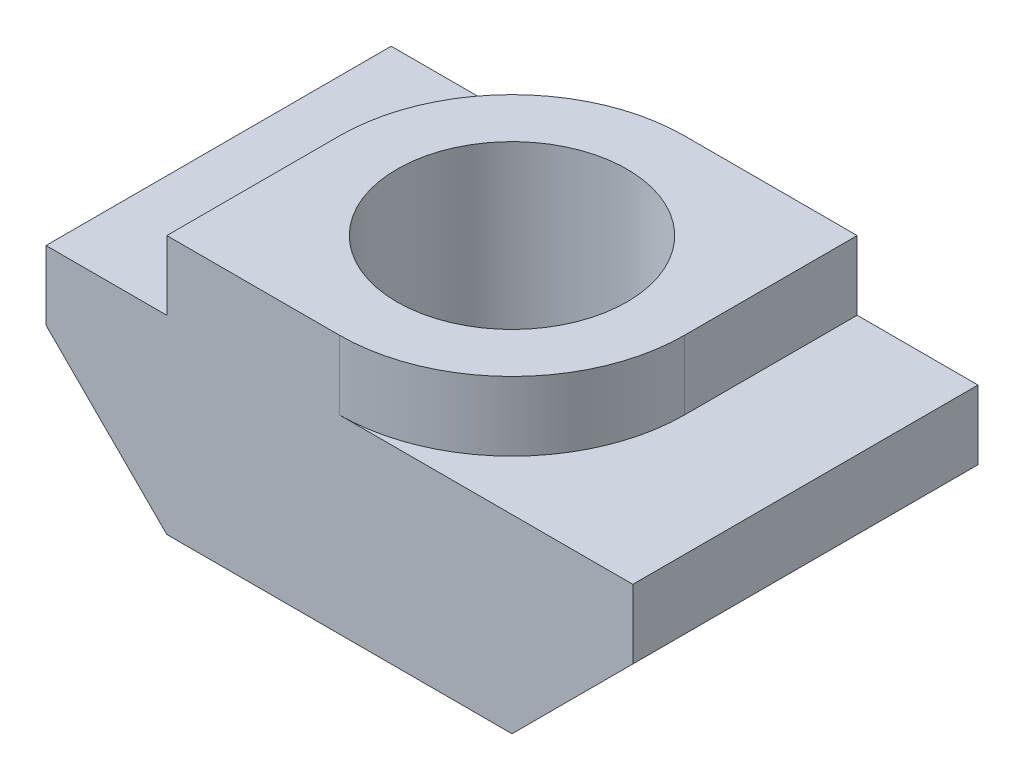
ISO-10303-21;
HEADER;
FILE_DESCRIPTION(('STEP AP214'),'2;1');
FILE_NAME('part.step','',(''),(''),'','','');
FILE_SCHEMA(('AUTOMOTIVE_DESIGN { 1 0 10303 214 1 1 1 1 }'));
ENDSEC;
DATA;
#1=APPLICATION_CONTEXT('core data for automotive mechanical design processes');
#2=APPLICATION_PROTOCOL_DEFINITION('international standard','automotive_design',2000,#1);
#3=PRODUCT_CONTEXT('',#1,'mechanical');
#4=PRODUCT('Part','Part','',(#3));
#5=PRODUCT_RELATED_PRODUCT_CATEGORY('part','',(#4));
#6=PRODUCT_DEFINITION_FORMATION('','',#4);
#7=PRODUCT_DEFINITION_CONTEXT('part definition',#1,'design');
#8=PRODUCT_DEFINITION('design','',#6,#7);
#9=PRODUCT_DEFINITION_SHAPE('','',#8);
#10=(LENGTH_UNIT() NAMED_UNIT(*) SI_UNIT(.MILLI.,.METRE.));
#11=(NAMED_UNIT(*) PLANE_ANGLE_UNIT() SI_UNIT($,.RADIAN.));
#12=(NAMED_UNIT(*) SI_UNIT($,.STERADIAN.) SOLID_ANGLE_UNIT());
#13=UNCERTAINTY_MEASURE_WITH_UNIT(LENGTH_MEASURE(1.E-05),#10,'distance_accuracy_value','');
#14=(GEOMETRIC_REPRESENTATION_CONTEXT(3) GLOBAL_UNCERTAINTY_ASSIGNED_CONTEXT((#13)) GLOBAL_UNIT_ASSIGNED_CONTEXT((#10,
#11,#12)) REPRESENTATION_CONTEXT('',''));
#15=CARTESIAN_POINT('',(0.,0.,0.));
#16=DIRECTION('',(0.,0.,1.));
#17=DIRECTION('',(1.,0.,0.));
#18=AXIS2_PLACEMENT_3D('',#15,#16,#17);
#19=CARTESIAN_POINT('',(0.,3.3,0.));
#20=DIRECTION('',(0.,-1.,0.));
#21=DIRECTION('',(0.,0.,-1.));
#22=AXIS2_PLACEMENT_3D('',#19,#20,#21);
#23=PLANE('',#22);
#24=DIRECTION('',(0.,0.,1.));
#25=VECTOR('',#24,1.);
#26=CARTESIAN_POINT('',(2.1,3.3,0.));
#27=LINE('',#26,#25);
#28=CARTESIAN_POINT('',(2.1,3.3,-3.));
#29=VERTEX_POINT('',#28);
#30=CARTESIAN_POINT('',(2.1,3.3,0.));
#31=VERTEX_POINT('',#30);
#32=EDGE_CURVE('E127',#29,#31,#27,.T.);
#33=ORIENTED_EDGE('',*,*,#32,.F.);
#34=CARTESIAN_POINT('',(5.1,3.3,-3.));
#35=DIRECTION('',(0.,-1.,0.));
#36=DIRECTION('',(0.,0.,-1.));
#37=AXIS2_PLACEMENT_3D('',#34,#35,#36);
#38=CIRCLE('',#37,3.);
#39=CARTESIAN_POINT('',(5.1,3.3,-6.));
#40=VERTEX_POINT('',#39);
#41=EDGE_CURVE('E186',#29,#40,#38,.T.);
#42=ORIENTED_EDGE('',*,*,#41,.T.);
#43=DIRECTION('',(-1.,0.,0.));
#44=VECTOR('',#43,1.);
#45=CARTESIAN_POINT('',(0.,3.3,-6.));
#46=LINE('',#45,#44);
#47=CARTESIAN_POINT('',(0.,3.3,-6.));
#48=VERTEX_POINT('',#47);
#49=EDGE_CURVE('E149',#40,#48,#46,.T.);
#50=ORIENTED_EDGE('',*,*,#49,.T.);
#51=DIRECTION('',(0.,0.,1.));
#52=VECTOR('',#51,1.);
#53=CARTESIAN_POINT('',(0.,3.3,0.));
#54=LINE('',#53,#52);
#55=CARTESIAN_POINT('',(0.,3.3,0.));
#56=VERTEX_POINT('',#55);
#57=EDGE_CURVE('E142',#48,#56,#54,.T.);
#58=ORIENTED_EDGE('',*,*,#57,.T.);
#59=DIRECTION('',(1.,0.,0.));
#60=VECTOR('',#59,1.);
#61=CARTESIAN_POINT('',(0.,3.3,0.));
#62=LINE('',#61,#60);
#63=EDGE_CURVE('E223',#56,#31,#62,.T.);
#64=ORIENTED_EDGE('',*,*,#63,.T.);
#65=EDGE_LOOP('',(#33,#42,#50,#58,#64));
#66=FACE_BOUND('',#65,.T.);
#67=ADVANCED_FACE('F33',(#66),#23,.F.);
#68=CARTESIAN_POINT('',(0.,3.3,0.));
#69=DIRECTION('',(1.,0.,0.));
#70=DIRECTION('',(0.,0.,-1.));
#71=AXIS2_PLACEMENT_3D('',#68,#69,#70);
#72=PLANE('',#71);
#73=DIRECTION('',(0.,-1.,0.));
#74=VECTOR('',#73,1.);
#75=CARTESIAN_POINT('',(0.,3.3,-6.));
#76=LINE('',#75,#74);
#77=CARTESIAN_POINT('',(0.,2.1,-6.));
#78=VERTEX_POINT('',#77);
#79=EDGE_CURVE('E135',#48,#78,#76,.T.);
#80=ORIENTED_EDGE('',*,*,#79,.T.);
#81=DIRECTION('',(0.,0.,1.));
#82=VECTOR('',#81,1.);
#83=CARTESIAN_POINT('',(0.,2.1,-6.));
#84=LINE('',#83,#82);
#85=CARTESIAN_POINT('',(0.,2.1,0.));
#86=VERTEX_POINT('',#85);
#87=EDGE_CURVE('E120',#78,#86,#84,.T.);
#88=ORIENTED_EDGE('',*,*,#87,.T.);
#89=DIRECTION('',(0.,-1.,0.));
#90=VECTOR('',#89,1.);
#91=CARTESIAN_POINT('',(0.,3.3,0.));
#92=LINE('',#91,#90);
#93=EDGE_CURVE('E11',#56,#86,#92,.T.);
#94=ORIENTED_EDGE('',*,*,#93,.F.);
#95=ORIENTED_EDGE('',*,*,#57,.F.);
#96=EDGE_LOOP('',(#80,#88,#94,#95));
#97=FACE_BOUND('',#96,.T.);
#98=ADVANCED_FACE('F35',(#97),#72,.F.);
#99=CARTESIAN_POINT('',(0.,3.3,0.));
#100=DIRECTION('',(0.,0.,-1.));
#101=DIRECTION('',(-1.,0.,0.));
#102=AXIS2_PLACEMENT_3D('',#99,#100,#101);
#103=PLANE('',#102);
#104=ORIENTED_EDGE('',*,*,#93,.T.);
#105=DIRECTION('',(-0.707106781186546,0.707106781186549,0.));
#106=VECTOR('',#105,1.);
#107=CARTESIAN_POINT('',(0.,2.1,0.));
#108=LINE('',#107,#106);
#109=CARTESIAN_POINT('',(2.09999999999999,0.,0.));
#110=VERTEX_POINT('',#109);
#111=EDGE_CURVE('E123',#110,#86,#108,.T.);
#112=ORIENTED_EDGE('',*,*,#111,.F.);
#113=DIRECTION('',(1.,0.,0.));
#114=VECTOR('',#113,1.);
#115=CARTESIAN_POINT('',(0.,0.,0.));
#116=LINE('',#115,#114);
#117=CARTESIAN_POINT('',(8.10000000000001,0.,0.));
#118=VERTEX_POINT('',#117);
#119=EDGE_CURVE('E169',#110,#118,#116,.T.);
#120=ORIENTED_EDGE('',*,*,#119,.T.);
#121=DIRECTION('',(-0.707106781186546,-0.707106781186549,0.));
#122=VECTOR('',#121,1.);
#123=CARTESIAN_POINT('',(8.10000000000001,0.,0.));
#124=LINE('',#123,#122);
#125=CARTESIAN_POINT('',(10.2,2.1,0.));
#126=VERTEX_POINT('',#125);
#127=EDGE_CURVE('E48',#126,#118,#124,.T.);
#128=ORIENTED_EDGE('',*,*,#127,.F.);
#129=DIRECTION('',(0.,-1.,0.));
#130=VECTOR('',#129,1.);
#131=CARTESIAN_POINT('',(10.2,3.3,0.));
#132=LINE('',#131,#130);
#133=CARTESIAN_POINT('',(10.2,3.3,0.));
#134=VERTEX_POINT('',#133);
#135=EDGE_CURVE('E41',#134,#126,#132,.T.);
#136=ORIENTED_EDGE('',*,*,#135,.F.);
#137=CARTESIAN_POINT('',(5.1,3.3,0.));
#138=VERTEX_POINT('',#137);
#139=EDGE_CURVE('E166',#138,#134,#62,.T.);
#140=ORIENTED_EDGE('',*,*,#139,.F.);
#141=DIRECTION('',(0.,-1.,0.));
#142=VECTOR('',#141,1.);
#143=CARTESIAN_POINT('',(5.1,4.5,0.));
#144=LINE('',#143,#142);
#145=CARTESIAN_POINT('',(5.1,4.5,0.));
#146=VERTEX_POINT('',#145);
#147=EDGE_CURVE('E218',#146,#138,#144,.T.);
#148=ORIENTED_EDGE('',*,*,#147,.F.);
#149=DIRECTION('',(1.,0.,0.));
#150=VECTOR('',#149,1.);
#151=CARTESIAN_POINT('',(0.,4.5,0.));
#152=LINE('',#151,#150);
#153=CARTESIAN_POINT('',(2.1,4.5,0.));
#154=VERTEX_POINT('',#153);
#155=EDGE_CURVE('E185',#154,#146,#152,.T.);
#156=ORIENTED_EDGE('',*,*,#155,.F.);
#157=DIRECTION('',(0.,-1.,0.));
#158=VECTOR('',#157,1.);
#159=CARTESIAN_POINT('',(2.1,4.5,0.));
#160=LINE('',#159,#158);
#161=EDGE_CURVE('E220',#154,#31,#160,.T.);
#162=ORIENTED_EDGE('',*,*,#161,.T.);
#163=ORIENTED_EDGE('',*,*,#63,.F.);
#164=EDGE_LOOP('',(#104,#112,#120,#128,#136,#140,#148,#156,#162,#163));
#165=FACE_BOUND('',#164,.T.);
#166=ADVANCED_FACE('F164',(#165),#103,.F.);
#167=CARTESIAN_POINT('',(10.2,3.3,0.));
#168=DIRECTION('',(-1.,0.,0.));
#169=DIRECTION('',(0.,0.,1.));
#170=AXIS2_PLACEMENT_3D('',#167,#168,#169);
#171=PLANE('',#170);
#172=ORIENTED_EDGE('',*,*,#135,.T.);
#173=DIRECTION('',(0.,0.,1.));
#174=VECTOR('',#173,1.);
#175=CARTESIAN_POINT('',(10.2,2.1,-6.));
#176=LINE('',#175,#174);
#177=CARTESIAN_POINT('',(10.2,2.1,-6.));
#178=VERTEX_POINT('',#177);
#179=EDGE_CURVE('E160',#178,#126,#176,.T.);
#180=ORIENTED_EDGE('',*,*,#179,.F.);
#181=DIRECTION('',(0.,-1.,0.));
#182=VECTOR('',#181,1.);
#183=CARTESIAN_POINT('',(10.2,3.3,-6.));
#184=LINE('',#183,#182);
#185=CARTESIAN_POINT('',(10.2,3.3,-6.));
#186=VERTEX_POINT('',#185);
#187=EDGE_CURVE('E143',#186,#178,#184,.T.);
#188=ORIENTED_EDGE('',*,*,#187,.F.);
#189=DIRECTION('',(0.,0.,-1.));
#190=VECTOR('',#189,1.);
#191=CARTESIAN_POINT('',(10.2,3.3,0.));
#192=LINE('',#191,#190);
#193=EDGE_CURVE('E161',#134,#186,#192,.T.);
#194=ORIENTED_EDGE('',*,*,#193,.F.);
#195=EDGE_LOOP('',(#172,#180,#188,#194));
#196=FACE_BOUND('',#195,.T.);
#197=ADVANCED_FACE('F158',(#196),#171,.F.);
#198=CARTESIAN_POINT('',(0.,3.3,-6.));
#199=DIRECTION('',(0.,0.,1.));
#200=DIRECTION('',(1.,0.,0.));
#201=AXIS2_PLACEMENT_3D('',#198,#199,#200);
#202=PLANE('',#201);
#203=DIRECTION('',(-1.,0.,0.));
#204=VECTOR('',#203,1.);
#205=CARTESIAN_POINT('',(0.,0.,-6.));
#206=LINE('',#205,#204);
#207=CARTESIAN_POINT('',(8.10000000000001,0.,-6.));
#208=VERTEX_POINT('',#207);
#209=CARTESIAN_POINT('',(2.09999999999999,0.,-6.));
#210=VERTEX_POINT('',#209);
#211=EDGE_CURVE('E139',#208,#210,#206,.T.);
#212=ORIENTED_EDGE('',*,*,#211,.T.);
#213=DIRECTION('',(-0.707106781186546,0.707106781186549,0.));
#214=VECTOR('',#213,1.);
#215=CARTESIAN_POINT('',(0.,2.1,-6.));
#216=LINE('',#215,#214);
#217=EDGE_CURVE('E56',#210,#78,#216,.T.);
#218=ORIENTED_EDGE('',*,*,#217,.T.);
#219=ORIENTED_EDGE('',*,*,#79,.F.);
#220=ORIENTED_EDGE('',*,*,#49,.F.);
#221=DIRECTION('',(0.,-1.,0.));
#222=VECTOR('',#221,1.);
#223=CARTESIAN_POINT('',(5.1,4.5,-6.));
#224=LINE('',#223,#222);
#225=CARTESIAN_POINT('',(5.1,4.5,-6.));
#226=VERTEX_POINT('',#225);
#227=EDGE_CURVE('E212',#226,#40,#224,.T.);
#228=ORIENTED_EDGE('',*,*,#227,.F.);
#229=DIRECTION('',(1.,0.,0.));
#230=VECTOR('',#229,1.);
#231=CARTESIAN_POINT('',(0.,4.5,-6.));
#232=LINE('',#231,#230);
#233=CARTESIAN_POINT('',(8.1,4.5,-6.));
#234=VERTEX_POINT('',#233);
#235=EDGE_CURVE('E194',#226,#234,#232,.T.);
#236=ORIENTED_EDGE('',*,*,#235,.T.);
#237=DIRECTION('',(0.,-1.,0.));
#238=VECTOR('',#237,1.);
#239=CARTESIAN_POINT('',(8.1,4.5,-6.));
#240=LINE('',#239,#238);
#241=CARTESIAN_POINT('',(8.1,3.3,-6.));
#242=VERTEX_POINT('',#241);
#243=EDGE_CURVE('E214',#234,#242,#240,.T.);
#244=ORIENTED_EDGE('',*,*,#243,.T.);
#245=EDGE_CURVE('E144',#186,#242,#46,.T.);
#246=ORIENTED_EDGE('',*,*,#245,.F.);
#247=ORIENTED_EDGE('',*,*,#187,.T.);
#248=DIRECTION('',(-0.707106781186546,-0.707106781186549,0.));
#249=VECTOR('',#248,1.);
#250=CARTESIAN_POINT('',(8.10000000000001,0.,-6.));
#251=LINE('',#250,#249);
#252=EDGE_CURVE('E170',#178,#208,#251,.T.);
#253=ORIENTED_EDGE('',*,*,#252,.T.);
#254=EDGE_LOOP('',(#212,#218,#219,#220,#228,#236,#244,#246,#247,#253));
#255=FACE_BOUND('',#254,.T.);
#256=ADVANCED_FACE('F133',(#255),#202,.F.);
#257=ORIENTED_EDGE('',*,*,#245,.T.);
#258=DIRECTION('',(0.,0.,1.));
#259=VECTOR('',#258,1.);
#260=CARTESIAN_POINT('',(8.09999999999999,3.3,0.));
#261=LINE('',#260,#259);
#262=CARTESIAN_POINT('',(8.1,3.3,-3.));
#263=VERTEX_POINT('',#262);
#264=EDGE_CURVE('E206',#242,#263,#261,.T.);
#265=ORIENTED_EDGE('',*,*,#264,.T.);
#266=CARTESIAN_POINT('',(5.1,3.3,-3.));
#267=DIRECTION('',(0.,-1.,0.));
#268=DIRECTION('',(0.,0.,-1.));
#269=AXIS2_PLACEMENT_3D('',#266,#267,#268);
#270=CIRCLE('',#269,3.);
#271=EDGE_CURVE('E203',#263,#138,#270,.T.);
#272=ORIENTED_EDGE('',*,*,#271,.T.);
#273=ORIENTED_EDGE('',*,*,#139,.T.);
#274=ORIENTED_EDGE('',*,*,#193,.T.);
#275=EDGE_LOOP('',(#257,#265,#272,#273,#274));
#276=FACE_BOUND('',#275,.T.);
#277=ADVANCED_FACE('F249',(#276),#23,.F.);
#278=CARTESIAN_POINT('',(0.,0.,0.));
#279=DIRECTION('',(0.,-1.,0.));
#280=DIRECTION('',(0.,0.,-1.));
#281=AXIS2_PLACEMENT_3D('',#278,#279,#280);
#282=PLANE('',#281);
#283=CARTESIAN_POINT('',(5.1,0.,-3.));
#284=DIRECTION('',(0.,1.,0.));
#285=DIRECTION('',(0.,0.,1.));
#286=AXIS2_PLACEMENT_3D('',#283,#284,#285);
#287=CIRCLE('',#286,2.);
#288=CARTESIAN_POINT('',(5.1,0.,-1.));
#289=VERTEX_POINT('',#288);
#290=EDGE_CURVE('E175',#289,#289,#287,.T.);
#291=ORIENTED_EDGE('',*,*,#290,.T.);
#292=EDGE_LOOP('',(#291));
#293=FACE_BOUND('',#292,.T.);
#294=DIRECTION('',(0.,0.,1.));
#295=VECTOR('',#294,1.);
#296=CARTESIAN_POINT('',(2.09999999999999,0.,-6.));
#297=LINE('',#296,#295);
#298=EDGE_CURVE('E128',#210,#110,#297,.T.);
#299=ORIENTED_EDGE('',*,*,#298,.F.);
#300=ORIENTED_EDGE('',*,*,#211,.F.);
#301=DIRECTION('',(0.,0.,1.));
#302=VECTOR('',#301,1.);
#303=CARTESIAN_POINT('',(8.10000000000001,0.,-6.));
#304=LINE('',#303,#302);
#305=EDGE_CURVE('E179',#208,#118,#304,.T.);
#306=ORIENTED_EDGE('',*,*,#305,.T.);
#307=ORIENTED_EDGE('',*,*,#119,.F.);
#308=EDGE_LOOP('',(#299,#300,#306,#307));
#309=FACE_BOUND('',#308,.T.);
#310=ADVANCED_FACE('F251',(#293,#309),#282,.T.);
#311=CARTESIAN_POINT('',(2.1,4.5,0.));
#312=DIRECTION('',(1.,0.,0.));
#313=DIRECTION('',(0.,0.,-1.));
#314=AXIS2_PLACEMENT_3D('',#311,#312,#313);
#315=PLANE('',#314);
#316=ORIENTED_EDGE('',*,*,#32,.T.);
#317=ORIENTED_EDGE('',*,*,#161,.F.);
#318=DIRECTION('',(0.,0.,1.));
#319=VECTOR('',#318,1.);
#320=CARTESIAN_POINT('',(2.1,4.5,0.));
#321=LINE('',#320,#319);
#322=CARTESIAN_POINT('',(2.1,4.5,-3.));
#323=VERTEX_POINT('',#322);
#324=EDGE_CURVE('E182',#323,#154,#321,.T.);
#325=ORIENTED_EDGE('',*,*,#324,.F.);
#326=DIRECTION('',(0.,-1.,0.));
#327=VECTOR('',#326,1.);
#328=CARTESIAN_POINT('',(2.1,4.5,-3.));
#329=LINE('',#328,#327);
#330=EDGE_CURVE('E200',#323,#29,#329,.T.);
#331=ORIENTED_EDGE('',*,*,#330,.T.);
#332=EDGE_LOOP('',(#316,#317,#325,#331));
#333=FACE_BOUND('',#332,.T.);
#334=ADVANCED_FACE('F241',(#333),#315,.F.);
#335=CARTESIAN_POINT('',(5.1,4.5,-3.));
#336=DIRECTION('',(0.,-1.,0.));
#337=DIRECTION('',(0.,0.,-1.));
#338=AXIS2_PLACEMENT_3D('',#335,#336,#337);
#339=CYLINDRICAL_SURFACE('',#338,3.);
#340=ORIENTED_EDGE('',*,*,#271,.F.);
#341=DIRECTION('',(0.,-1.,0.));
#342=VECTOR('',#341,1.);
#343=CARTESIAN_POINT('',(8.1,4.5,-3.));
#344=LINE('',#343,#342);
#345=CARTESIAN_POINT('',(8.1,4.5,-3.));
#346=VERTEX_POINT('',#345);
#347=EDGE_CURVE('E216',#346,#263,#344,.T.);
#348=ORIENTED_EDGE('',*,*,#347,.F.);
#349=CARTESIAN_POINT('',(5.1,4.5,-3.));
#350=DIRECTION('',(0.,-1.,0.));
#351=DIRECTION('',(0.,0.,-1.));
#352=AXIS2_PLACEMENT_3D('',#349,#350,#351);
#353=CIRCLE('',#352,3.);
#354=EDGE_CURVE('E188',#346,#146,#353,.T.);
#355=ORIENTED_EDGE('',*,*,#354,.T.);
#356=ORIENTED_EDGE('',*,*,#147,.T.);
#357=EDGE_LOOP('',(#340,#348,#355,#356));
#358=FACE_BOUND('',#357,.T.);
#359=ADVANCED_FACE('F244',(#358),#339,.T.);
#360=CARTESIAN_POINT('',(8.09999999999999,4.5,0.));
#361=DIRECTION('',(1.,0.,0.));
#362=DIRECTION('',(0.,0.,-1.));
#363=AXIS2_PLACEMENT_3D('',#360,#361,#362);
#364=PLANE('',#363);
#365=ORIENTED_EDGE('',*,*,#264,.F.);
#366=ORIENTED_EDGE('',*,*,#243,.F.);
#367=DIRECTION('',(0.,0.,1.));
#368=VECTOR('',#367,1.);
#369=CARTESIAN_POINT('',(8.09999999999999,4.5,0.));
#370=LINE('',#369,#368);
#371=EDGE_CURVE('E191',#234,#346,#370,.T.);
#372=ORIENTED_EDGE('',*,*,#371,.T.);
#373=ORIENTED_EDGE('',*,*,#347,.T.);
#374=EDGE_LOOP('',(#365,#366,#372,#373));
#375=FACE_BOUND('',#374,.T.);
#376=ADVANCED_FACE('F247',(#375),#364,.T.);
#377=CARTESIAN_POINT('',(5.1,4.5,-3.));
#378=DIRECTION('',(0.,-1.,0.));
#379=DIRECTION('',(0.,0.,-1.));
#380=AXIS2_PLACEMENT_3D('',#377,#378,#379);
#381=CYLINDRICAL_SURFACE('',#380,3.);
#382=ORIENTED_EDGE('',*,*,#41,.F.);
#383=ORIENTED_EDGE('',*,*,#330,.F.);
#384=CARTESIAN_POINT('',(5.1,4.5,-3.));
#385=DIRECTION('',(0.,-1.,0.));
#386=DIRECTION('',(0.,0.,-1.));
#387=AXIS2_PLACEMENT_3D('',#384,#385,#386);
#388=CIRCLE('',#387,3.);
#389=EDGE_CURVE('E197',#323,#226,#388,.T.);
#390=ORIENTED_EDGE('',*,*,#389,.T.);
#391=ORIENTED_EDGE('',*,*,#227,.T.);
#392=EDGE_LOOP('',(#382,#383,#390,#391));
#393=FACE_BOUND('',#392,.T.);
#394=ADVANCED_FACE('F237',(#393),#381,.T.);
#395=CARTESIAN_POINT('',(5.1,4.5,-3.));
#396=DIRECTION('',(0.,-1.,0.));
#397=DIRECTION('',(0.,0.,-1.));
#398=AXIS2_PLACEMENT_3D('',#395,#396,#397);
#399=PLANE('',#398);
#400=CARTESIAN_POINT('',(5.1,4.5,-3.));
#401=DIRECTION('',(0.,1.,0.));
#402=DIRECTION('',(0.,0.,1.));
#403=AXIS2_PLACEMENT_3D('',#400,#401,#402);
#404=CIRCLE('',#403,2.);
#405=CARTESIAN_POINT('',(5.1,4.5,-1.));
#406=VERTEX_POINT('',#405);
#407=EDGE_CURVE('E171',#406,#406,#404,.T.);
#408=ORIENTED_EDGE('',*,*,#407,.F.);
#409=EDGE_LOOP('',(#408));
#410=FACE_BOUND('',#409,.T.);
#411=ORIENTED_EDGE('',*,*,#324,.T.);
#412=ORIENTED_EDGE('',*,*,#155,.T.);
#413=ORIENTED_EDGE('',*,*,#354,.F.);
#414=ORIENTED_EDGE('',*,*,#371,.F.);
#415=ORIENTED_EDGE('',*,*,#235,.F.);
#416=ORIENTED_EDGE('',*,*,#389,.F.);
#417=EDGE_LOOP('',(#411,#412,#413,#414,#415,#416));
#418=FACE_BOUND('',#417,.T.);
#419=ADVANCED_FACE('F235',(#410,#418),#399,.F.);
#420=CARTESIAN_POINT('',(8.10000000000001,0.,-6.));
#421=DIRECTION('',(-0.707106781186549,0.707106781186546,0.));
#422=DIRECTION('',(-0.707106781186546,-0.707106781186549,0.));
#423=AXIS2_PLACEMENT_3D('',#420,#421,#422);
#424=PLANE('',#423);
#425=ORIENTED_EDGE('',*,*,#127,.T.);
#426=ORIENTED_EDGE('',*,*,#305,.F.);
#427=ORIENTED_EDGE('',*,*,#252,.F.);
#428=ORIENTED_EDGE('',*,*,#179,.T.);
#429=EDGE_LOOP('',(#425,#426,#427,#428));
#430=FACE_BOUND('',#429,.T.);
#431=ADVANCED_FACE('F286',(#430),#424,.F.);
#432=CARTESIAN_POINT('',(0.,2.1,-6.));
#433=DIRECTION('',(0.707106781186549,0.707106781186546,0.));
#434=DIRECTION('',(-0.707106781186546,0.707106781186549,0.));
#435=AXIS2_PLACEMENT_3D('',#432,#433,#434);
#436=PLANE('',#435);
#437=ORIENTED_EDGE('',*,*,#111,.T.);
#438=ORIENTED_EDGE('',*,*,#87,.F.);
#439=ORIENTED_EDGE('',*,*,#217,.F.);
#440=ORIENTED_EDGE('',*,*,#298,.T.);
#441=EDGE_LOOP('',(#437,#438,#439,#440));
#442=FACE_BOUND('',#441,.T.);
#443=ADVANCED_FACE('F121',(#442),#436,.F.);
#444=CARTESIAN_POINT('',(5.1,4.5,-3.));
#445=DIRECTION('',(0.,-1.,0.));
#446=DIRECTION('',(0.,0.,-1.));
#447=AXIS2_PLACEMENT_3D('',#444,#445,#446);
#448=CYLINDRICAL_SURFACE('',#447,2.);
#449=ORIENTED_EDGE('',*,*,#407,.T.);
#450=EDGE_LOOP('',(#449));
#451=FACE_BOUND('',#450,.T.);
#452=ORIENTED_EDGE('',*,*,#290,.F.);
#453=EDGE_LOOP('',(#452));
#454=FACE_BOUND('',#453,.T.);
#455=ADVANCED_FACE('F301',(#451,#454),#448,.F.);
#456=CLOSED_SHELL('',(#67,#98,#166,#197,#256,#277,#310,#334,#359,#376,#394,#419,#431,#443,#455));
#457=MANIFOLD_SOLID_BREP('B2',#456);
#458=ADVANCED_BREP_SHAPE_REPRESENTATION('',(#18,#457),#14);
#459=SHAPE_DEFINITION_REPRESENTATION(#9,#458);
ENDSEC;
END-ISO-10303-21;
